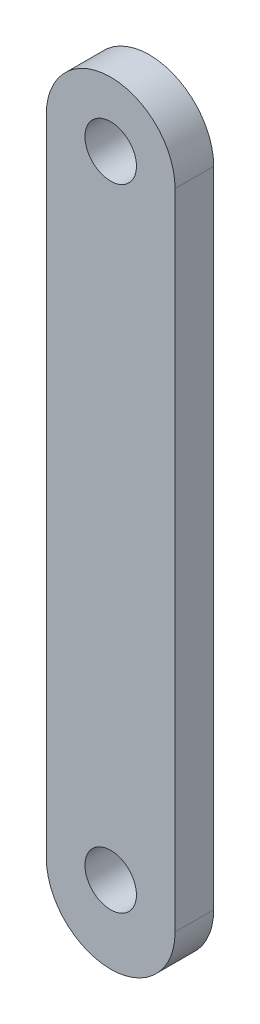
ISO-10303-21;
HEADER;
FILE_DESCRIPTION(('STEP AP214'),'2;1');
FILE_NAME('part.step','',(''),(''),'','','');
FILE_SCHEMA(('AUTOMOTIVE_DESIGN { 1 0 10303 214 1 1 1 1 }'));
ENDSEC;
DATA;
#1=APPLICATION_CONTEXT('core data for automotive mechanical design processes');
#2=APPLICATION_PROTOCOL_DEFINITION('international standard','automotive_design',2000,#1);
#3=PRODUCT_CONTEXT('',#1,'mechanical');
#4=PRODUCT('Part','Part','',(#3));
#5=PRODUCT_RELATED_PRODUCT_CATEGORY('part','',(#4));
#6=PRODUCT_DEFINITION_FORMATION('','',#4);
#7=PRODUCT_DEFINITION_CONTEXT('part definition',#1,'design');
#8=PRODUCT_DEFINITION('design','',#6,#7);
#9=PRODUCT_DEFINITION_SHAPE('','',#8);
#10=(LENGTH_UNIT() NAMED_UNIT(*) SI_UNIT(.MILLI.,.METRE.));
#11=(NAMED_UNIT(*) PLANE_ANGLE_UNIT() SI_UNIT($,.RADIAN.));
#12=(NAMED_UNIT(*) SI_UNIT($,.STERADIAN.) SOLID_ANGLE_UNIT());
#13=UNCERTAINTY_MEASURE_WITH_UNIT(LENGTH_MEASURE(1.E-05),#10,'distance_accuracy_value','');
#14=(GEOMETRIC_REPRESENTATION_CONTEXT(3) GLOBAL_UNCERTAINTY_ASSIGNED_CONTEXT((#13)) GLOBAL_UNIT_ASSIGNED_CONTEXT((#10,
#11,#12)) REPRESENTATION_CONTEXT('',''));
#15=CARTESIAN_POINT('',(0.,0.,0.));
#16=DIRECTION('',(0.,0.,1.));
#17=DIRECTION('',(1.,0.,0.));
#18=AXIS2_PLACEMENT_3D('',#15,#16,#17);
#19=CARTESIAN_POINT('',(0.,25.,3.));
#20=DIRECTION('',(0.,0.,1.));
#21=DIRECTION('',(1.,0.,0.));
#22=AXIS2_PLACEMENT_3D('',#19,#20,#21);
#23=PLANE('',#22);
#24=CARTESIAN_POINT('',(0.,25.,3.));
#25=DIRECTION('',(0.,0.,1.));
#26=DIRECTION('',(1.,0.,0.));
#27=AXIS2_PLACEMENT_3D('',#24,#25,#26);
#28=CIRCLE('',#27,2.00000000000001);
#29=CARTESIAN_POINT('',(2.00000000000001,25.,3.));
#30=VERTEX_POINT('',#29);
#31=EDGE_CURVE('E118',#30,#30,#28,.T.);
#32=ORIENTED_EDGE('',*,*,#31,.F.);
#33=EDGE_LOOP('',(#32));
#34=FACE_BOUND('',#33,.T.);
#35=CARTESIAN_POINT('',(0.,25.,3.));
#36=DIRECTION('',(0.,0.,1.));
#37=DIRECTION('',(1.,0.,0.));
#38=AXIS2_PLACEMENT_3D('',#35,#36,#37);
#39=CIRCLE('',#38,4.99999999999999);
#40=CARTESIAN_POINT('',(4.99999999999998,25.,3.));
#41=VERTEX_POINT('',#40);
#42=CARTESIAN_POINT('',(-5.,25.,3.));
#43=VERTEX_POINT('',#42);
#44=EDGE_CURVE('E98',#41,#43,#39,.T.);
#45=ORIENTED_EDGE('',*,*,#44,.T.);
#46=DIRECTION('',(0.,-1.,0.));
#47=VECTOR('',#46,1.);
#48=CARTESIAN_POINT('',(-5.,25.,3.));
#49=LINE('',#48,#47);
#50=CARTESIAN_POINT('',(-4.99999999999998,-25.,3.));
#51=VERTEX_POINT('',#50);
#52=EDGE_CURVE('E93',#43,#51,#49,.T.);
#53=ORIENTED_EDGE('',*,*,#52,.T.);
#54=CARTESIAN_POINT('',(0.,-25.,3.));
#55=DIRECTION('',(0.,0.,1.));
#56=DIRECTION('',(1.,0.,0.));
#57=AXIS2_PLACEMENT_3D('',#54,#55,#56);
#58=CIRCLE('',#57,4.99999999999999);
#59=CARTESIAN_POINT('',(5.,-25.,3.));
#60=VERTEX_POINT('',#59);
#61=EDGE_CURVE('E96',#51,#60,#58,.T.);
#62=ORIENTED_EDGE('',*,*,#61,.T.);
#63=DIRECTION('',(0.,1.,0.));
#64=VECTOR('',#63,1.);
#65=CARTESIAN_POINT('',(4.99999999999998,25.,3.));
#66=LINE('',#65,#64);
#67=EDGE_CURVE('E63',#60,#41,#66,.T.);
#68=ORIENTED_EDGE('',*,*,#67,.T.);
#69=EDGE_LOOP('',(#45,#53,#62,#68));
#70=FACE_BOUND('',#69,.T.);
#71=CARTESIAN_POINT('',(0.,-24.,3.));
#72=DIRECTION('',(0.,0.,1.));
#73=DIRECTION('',(1.,0.,0.));
#74=AXIS2_PLACEMENT_3D('',#71,#72,#73);
#75=CIRCLE('',#74,2.00000000000001);
#76=CARTESIAN_POINT('',(2.00000000000001,-24.,3.));
#77=VERTEX_POINT('',#76);
#78=EDGE_CURVE('E140',#77,#77,#75,.T.);
#79=ORIENTED_EDGE('',*,*,#78,.F.);
#80=EDGE_LOOP('',(#79));
#81=FACE_BOUND('',#80,.T.);
#82=ADVANCED_FACE('F45',(#34,#70,#81),#23,.T.);
#83=CARTESIAN_POINT('',(0.,25.,0.));
#84=DIRECTION('',(0.,0.,1.));
#85=DIRECTION('',(1.,0.,0.));
#86=AXIS2_PLACEMENT_3D('',#83,#84,#85);
#87=PLANE('',#86);
#88=CARTESIAN_POINT('',(0.,25.,0.));
#89=DIRECTION('',(0.,0.,1.));
#90=DIRECTION('',(1.,0.,0.));
#91=AXIS2_PLACEMENT_3D('',#88,#89,#90);
#92=CIRCLE('',#91,4.99999999999999);
#93=CARTESIAN_POINT('',(4.99999999999998,25.,0.));
#94=VERTEX_POINT('',#93);
#95=CARTESIAN_POINT('',(-5.,25.,0.));
#96=VERTEX_POINT('',#95);
#97=EDGE_CURVE('E114',#94,#96,#92,.T.);
#98=ORIENTED_EDGE('',*,*,#97,.F.);
#99=DIRECTION('',(0.,1.,0.));
#100=VECTOR('',#99,1.);
#101=CARTESIAN_POINT('',(4.99999999999998,25.,0.));
#102=LINE('',#101,#100);
#103=CARTESIAN_POINT('',(5.,-25.,0.));
#104=VERTEX_POINT('',#103);
#105=EDGE_CURVE('E86',#104,#94,#102,.T.);
#106=ORIENTED_EDGE('',*,*,#105,.F.);
#107=CARTESIAN_POINT('',(0.,-25.,0.));
#108=DIRECTION('',(0.,0.,1.));
#109=DIRECTION('',(1.,0.,0.));
#110=AXIS2_PLACEMENT_3D('',#107,#108,#109);
#111=CIRCLE('',#110,4.99999999999999);
#112=CARTESIAN_POINT('',(-4.99999999999998,-25.,0.));
#113=VERTEX_POINT('',#112);
#114=EDGE_CURVE('E80',#113,#104,#111,.T.);
#115=ORIENTED_EDGE('',*,*,#114,.F.);
#116=DIRECTION('',(0.,-1.,0.));
#117=VECTOR('',#116,1.);
#118=CARTESIAN_POINT('',(-5.,25.,0.));
#119=LINE('',#118,#117);
#120=EDGE_CURVE('E103',#96,#113,#119,.T.);
#121=ORIENTED_EDGE('',*,*,#120,.F.);
#122=EDGE_LOOP('',(#98,#106,#115,#121));
#123=FACE_BOUND('',#122,.T.);
#124=CARTESIAN_POINT('',(0.,25.,0.));
#125=DIRECTION('',(0.,0.,1.));
#126=DIRECTION('',(1.,0.,0.));
#127=AXIS2_PLACEMENT_3D('',#124,#125,#126);
#128=CIRCLE('',#127,2.00000000000001);
#129=CARTESIAN_POINT('',(2.00000000000001,25.,0.));
#130=VERTEX_POINT('',#129);
#131=EDGE_CURVE('E136',#130,#130,#128,.T.);
#132=ORIENTED_EDGE('',*,*,#131,.T.);
#133=EDGE_LOOP('',(#132));
#134=FACE_BOUND('',#133,.T.);
#135=CARTESIAN_POINT('',(0.,-24.,0.));
#136=DIRECTION('',(0.,0.,1.));
#137=DIRECTION('',(1.,0.,0.));
#138=AXIS2_PLACEMENT_3D('',#135,#136,#137);
#139=CIRCLE('',#138,2.00000000000001);
#140=CARTESIAN_POINT('',(2.00000000000001,-24.,0.));
#141=VERTEX_POINT('',#140);
#142=EDGE_CURVE('E144',#141,#141,#139,.T.);
#143=ORIENTED_EDGE('',*,*,#142,.T.);
#144=EDGE_LOOP('',(#143));
#145=FACE_BOUND('',#144,.T.);
#146=ADVANCED_FACE('F131',(#123,#134,#145),#87,.F.);
#147=CARTESIAN_POINT('',(0.,25.,3.));
#148=DIRECTION('',(0.,0.,-1.));
#149=DIRECTION('',(-1.,0.,0.));
#150=AXIS2_PLACEMENT_3D('',#147,#148,#149);
#151=CYLINDRICAL_SURFACE('',#150,4.99999999999999);
#152=ORIENTED_EDGE('',*,*,#97,.T.);
#153=DIRECTION('',(0.,0.,-1.));
#154=VECTOR('',#153,1.);
#155=CARTESIAN_POINT('',(-5.,25.,3.));
#156=LINE('',#155,#154);
#157=EDGE_CURVE('E11',#43,#96,#156,.T.);
#158=ORIENTED_EDGE('',*,*,#157,.F.);
#159=ORIENTED_EDGE('',*,*,#44,.F.);
#160=DIRECTION('',(0.,0.,-1.));
#161=VECTOR('',#160,1.);
#162=CARTESIAN_POINT('',(4.99999999999998,25.,3.));
#163=LINE('',#162,#161);
#164=EDGE_CURVE('E110',#41,#94,#163,.T.);
#165=ORIENTED_EDGE('',*,*,#164,.T.);
#166=EDGE_LOOP('',(#152,#158,#159,#165));
#167=FACE_BOUND('',#166,.T.);
#168=ADVANCED_FACE('F47',(#167),#151,.T.);
#169=CARTESIAN_POINT('',(-5.,25.,3.));
#170=DIRECTION('',(1.,0.,0.));
#171=DIRECTION('',(0.,1.,0.));
#172=AXIS2_PLACEMENT_3D('',#169,#170,#171);
#173=PLANE('',#172);
#174=ORIENTED_EDGE('',*,*,#120,.T.);
#175=DIRECTION('',(0.,0.,-1.));
#176=VECTOR('',#175,1.);
#177=CARTESIAN_POINT('',(-4.99999999999998,-25.,3.));
#178=LINE('',#177,#176);
#179=EDGE_CURVE('E55',#51,#113,#178,.T.);
#180=ORIENTED_EDGE('',*,*,#179,.F.);
#181=ORIENTED_EDGE('',*,*,#52,.F.);
#182=ORIENTED_EDGE('',*,*,#157,.T.);
#183=EDGE_LOOP('',(#174,#180,#181,#182));
#184=FACE_BOUND('',#183,.T.);
#185=ADVANCED_FACE('F102',(#184),#173,.F.);
#186=CARTESIAN_POINT('',(0.,-25.,3.));
#187=DIRECTION('',(0.,0.,-1.));
#188=DIRECTION('',(-1.,0.,0.));
#189=AXIS2_PLACEMENT_3D('',#186,#187,#188);
#190=CYLINDRICAL_SURFACE('',#189,4.99999999999999);
#191=ORIENTED_EDGE('',*,*,#114,.T.);
#192=DIRECTION('',(0.,0.,-1.));
#193=VECTOR('',#192,1.);
#194=CARTESIAN_POINT('',(5.,-25.,3.));
#195=LINE('',#194,#193);
#196=EDGE_CURVE('E105',#60,#104,#195,.T.);
#197=ORIENTED_EDGE('',*,*,#196,.F.);
#198=ORIENTED_EDGE('',*,*,#61,.F.);
#199=ORIENTED_EDGE('',*,*,#179,.T.);
#200=EDGE_LOOP('',(#191,#197,#198,#199));
#201=FACE_BOUND('',#200,.T.);
#202=ADVANCED_FACE('F106',(#201),#190,.T.);
#203=CARTESIAN_POINT('',(4.99999999999998,25.,3.));
#204=DIRECTION('',(-1.,0.,0.));
#205=DIRECTION('',(0.,-1.,0.));
#206=AXIS2_PLACEMENT_3D('',#203,#204,#205);
#207=PLANE('',#206);
#208=ORIENTED_EDGE('',*,*,#105,.T.);
#209=ORIENTED_EDGE('',*,*,#164,.F.);
#210=ORIENTED_EDGE('',*,*,#67,.F.);
#211=ORIENTED_EDGE('',*,*,#196,.T.);
#212=EDGE_LOOP('',(#208,#209,#210,#211));
#213=FACE_BOUND('',#212,.T.);
#214=ADVANCED_FACE('F128',(#213),#207,.F.);
#215=CARTESIAN_POINT('',(0.,25.,3.));
#216=DIRECTION('',(0.,0.,-1.));
#217=DIRECTION('',(-1.,0.,0.));
#218=AXIS2_PLACEMENT_3D('',#215,#216,#217);
#219=CYLINDRICAL_SURFACE('',#218,2.00000000000001);
#220=ORIENTED_EDGE('',*,*,#31,.T.);
#221=EDGE_LOOP('',(#220));
#222=FACE_BOUND('',#221,.T.);
#223=ORIENTED_EDGE('',*,*,#131,.F.);
#224=EDGE_LOOP('',(#223));
#225=FACE_BOUND('',#224,.T.);
#226=ADVANCED_FACE('F163',(#222,#225),#219,.F.);
#227=CARTESIAN_POINT('',(0.,-24.,3.));
#228=DIRECTION('',(0.,0.,-1.));
#229=DIRECTION('',(-1.,0.,0.));
#230=AXIS2_PLACEMENT_3D('',#227,#228,#229);
#231=CYLINDRICAL_SURFACE('',#230,2.00000000000001);
#232=ORIENTED_EDGE('',*,*,#78,.T.);
#233=EDGE_LOOP('',(#232));
#234=FACE_BOUND('',#233,.T.);
#235=ORIENTED_EDGE('',*,*,#142,.F.);
#236=EDGE_LOOP('',(#235));
#237=FACE_BOUND('',#236,.T.);
#238=ADVANCED_FACE('F152',(#234,#237),#231,.F.);
#239=CLOSED_SHELL('',(#82,#146,#168,#185,#202,#214,#226,#238));
#240=MANIFOLD_SOLID_BREP('B2',#239);
#241=ADVANCED_BREP_SHAPE_REPRESENTATION('',(#18,#240),#14);
#242=SHAPE_DEFINITION_REPRESENTATION(#9,#241);
ENDSEC;
END-ISO-10303-21;
